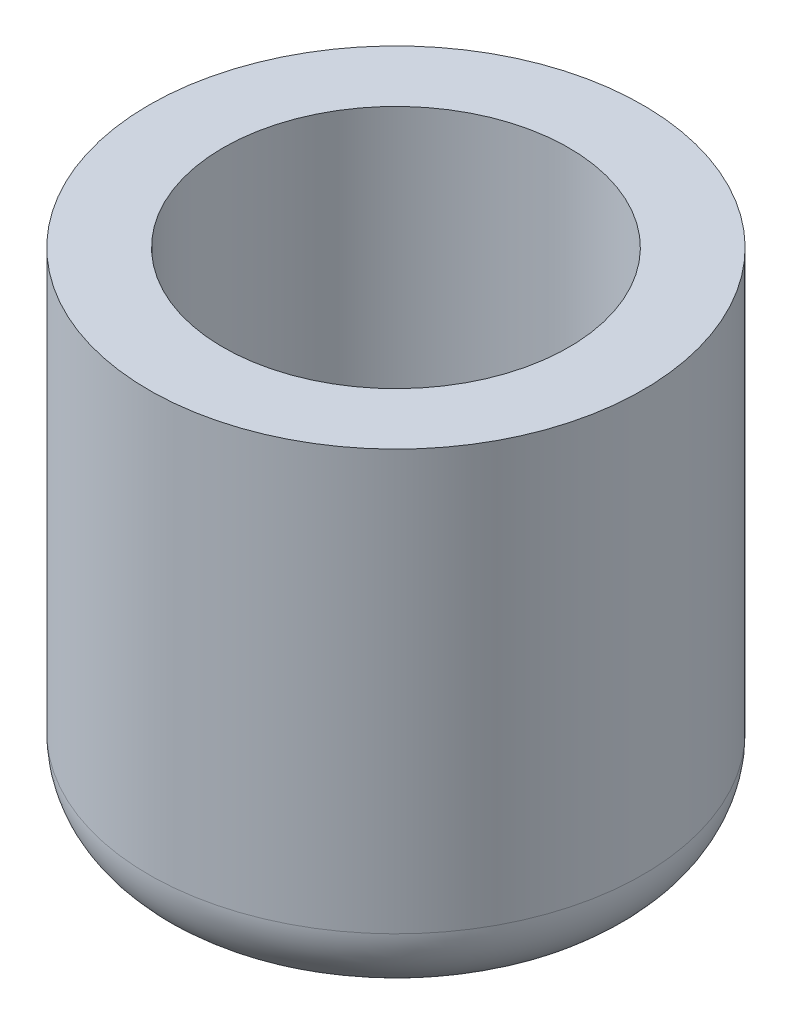
ISO-10303-21;
HEADER;
FILE_DESCRIPTION(('STEP AP214'),'2;1');
FILE_NAME('part.step','',(''),(''),'','','');
FILE_SCHEMA(('AUTOMOTIVE_DESIGN { 1 0 10303 214 1 1 1 1 }'));
ENDSEC;
DATA;
#1=APPLICATION_CONTEXT('core data for automotive mechanical design processes');
#2=APPLICATION_PROTOCOL_DEFINITION('international standard','automotive_design',2000,#1);
#3=PRODUCT_CONTEXT('',#1,'mechanical');
#4=PRODUCT('Part','Part','',(#3));
#5=PRODUCT_RELATED_PRODUCT_CATEGORY('part','',(#4));
#6=PRODUCT_DEFINITION_FORMATION('','',#4);
#7=PRODUCT_DEFINITION_CONTEXT('part definition',#1,'design');
#8=PRODUCT_DEFINITION('design','',#6,#7);
#9=PRODUCT_DEFINITION_SHAPE('','',#8);
#10=(LENGTH_UNIT() NAMED_UNIT(*) SI_UNIT(.MILLI.,.METRE.));
#11=(NAMED_UNIT(*) PLANE_ANGLE_UNIT() SI_UNIT($,.RADIAN.));
#12=(NAMED_UNIT(*) SI_UNIT($,.STERADIAN.) SOLID_ANGLE_UNIT());
#13=UNCERTAINTY_MEASURE_WITH_UNIT(LENGTH_MEASURE(1.E-05),#10,'distance_accuracy_value','');
#14=(GEOMETRIC_REPRESENTATION_CONTEXT(3) GLOBAL_UNCERTAINTY_ASSIGNED_CONTEXT((#13)) GLOBAL_UNIT_ASSIGNED_CONTEXT((#10,
#11,#12)) REPRESENTATION_CONTEXT('',''));
#15=CARTESIAN_POINT('',(0.,0.,0.));
#16=DIRECTION('',(0.,0.,1.));
#17=DIRECTION('',(1.,0.,0.));
#18=AXIS2_PLACEMENT_3D('',#15,#16,#17);
#19=CARTESIAN_POINT('',(0.,0.,0.));
#20=DIRECTION('',(0.,1.,0.));
#21=DIRECTION('',(-1.,0.,0.));
#22=AXIS2_PLACEMENT_3D('',#19,#20,#21);
#23=CYLINDRICAL_SURFACE('',#22,3.5);
#24=CARTESIAN_POINT('',(0.,0.,0.));
#25=DIRECTION('',(0.,1.,0.));
#26=DIRECTION('',(-1.,0.,0.));
#27=AXIS2_PLACEMENT_3D('',#24,#25,#26);
#28=CIRCLE('',#27,3.5);
#29=CARTESIAN_POINT('',(-3.5,0.,0.));
#30=VERTEX_POINT('',#29);
#31=EDGE_CURVE('E64',#30,#30,#28,.T.);
#32=ORIENTED_EDGE('',*,*,#31,.T.);
#33=EDGE_LOOP('',(#32));
#34=FACE_BOUND('',#33,.T.);
#35=CARTESIAN_POINT('',(0.,-8.5,0.));
#36=DIRECTION('',(0.,1.,0.));
#37=DIRECTION('',(-1.,0.,0.));
#38=AXIS2_PLACEMENT_3D('',#35,#36,#37);
#39=CIRCLE('',#38,3.5);
#40=CARTESIAN_POINT('',(-3.5,-8.5,0.));
#41=VERTEX_POINT('',#40);
#42=EDGE_CURVE('E55',#41,#41,#39,.T.);
#43=ORIENTED_EDGE('',*,*,#42,.F.);
#44=EDGE_LOOP('',(#43));
#45=FACE_BOUND('',#44,.T.);
#46=ADVANCED_FACE('F44',(#34,#45),#23,.F.);
#47=CARTESIAN_POINT('',(-5.,-8.5,0.));
#48=DIRECTION('',(0.,1.,0.));
#49=DIRECTION('',(-1.,0.,0.));
#50=AXIS2_PLACEMENT_3D('',#47,#48,#49);
#51=PLANE('',#50);
#52=ORIENTED_EDGE('',*,*,#42,.T.);
#53=EDGE_LOOP('',(#52));
#54=FACE_BOUND('',#53,.T.);
#55=ADVANCED_FACE('F83',(#54),#51,.T.);
#56=CARTESIAN_POINT('',(-5.,-10.,0.));
#57=DIRECTION('',(0.,1.,0.));
#58=DIRECTION('',(-1.,0.,0.));
#59=AXIS2_PLACEMENT_3D('',#56,#57,#58);
#60=PLANE('',#59);
#61=CARTESIAN_POINT('',(0.,-10.,0.));
#62=DIRECTION('',(0.,1.,0.));
#63=DIRECTION('',(-1.,0.,0.));
#64=AXIS2_PLACEMENT_3D('',#61,#62,#63);
#65=CIRCLE('',#64,3.5);
#66=CARTESIAN_POINT('',(-3.5,-10.,0.));
#67=VERTEX_POINT('',#66);
#68=EDGE_CURVE('E13',#67,#67,#65,.F.);
#69=ORIENTED_EDGE('',*,*,#68,.T.);
#70=EDGE_LOOP('',(#69));
#71=FACE_BOUND('',#70,.T.);
#72=ADVANCED_FACE('F78',(#71),#60,.F.);
#73=CARTESIAN_POINT('',(0.,0.,0.));
#74=DIRECTION('',(0.,1.,0.));
#75=DIRECTION('',(-1.,0.,0.));
#76=AXIS2_PLACEMENT_3D('',#73,#74,#75);
#77=CYLINDRICAL_SURFACE('',#76,5.);
#78=CARTESIAN_POINT('',(0.,-8.5,0.));
#79=DIRECTION('',(0.,1.,0.));
#80=DIRECTION('',(-1.,0.,0.));
#81=AXIS2_PLACEMENT_3D('',#78,#79,#80);
#82=CIRCLE('',#81,5.);
#83=CARTESIAN_POINT('',(-5.,-8.5,0.));
#84=VERTEX_POINT('',#83);
#85=EDGE_CURVE('E51',#84,#84,#82,.T.);
#86=ORIENTED_EDGE('',*,*,#85,.T.);
#87=EDGE_LOOP('',(#86));
#88=FACE_BOUND('',#87,.T.);
#89=CARTESIAN_POINT('',(0.,0.,0.));
#90=DIRECTION('',(0.,1.,0.));
#91=DIRECTION('',(-1.,0.,0.));
#92=AXIS2_PLACEMENT_3D('',#89,#90,#91);
#93=CIRCLE('',#92,5.);
#94=CARTESIAN_POINT('',(-5.,0.,0.));
#95=VERTEX_POINT('',#94);
#96=EDGE_CURVE('E59',#95,#95,#93,.T.);
#97=ORIENTED_EDGE('',*,*,#96,.F.);
#98=EDGE_LOOP('',(#97));
#99=FACE_BOUND('',#98,.T.);
#100=ADVANCED_FACE('F73',(#88,#99),#77,.T.);
#101=CARTESIAN_POINT('',(-5.,0.,0.));
#102=DIRECTION('',(0.,-1.,0.));
#103=DIRECTION('',(1.,0.,0.));
#104=AXIS2_PLACEMENT_3D('',#101,#102,#103);
#105=PLANE('',#104);
#106=ORIENTED_EDGE('',*,*,#31,.F.);
#107=EDGE_LOOP('',(#106));
#108=FACE_BOUND('',#107,.T.);
#109=ORIENTED_EDGE('',*,*,#96,.T.);
#110=EDGE_LOOP('',(#109));
#111=FACE_BOUND('',#110,.T.);
#112=ADVANCED_FACE('F70',(#108,#111),#105,.F.);
#113=CARTESIAN_POINT('',(0.,-8.5,0.));
#114=DIRECTION('',(0.,1.,0.));
#115=DIRECTION('',(-1.,0.,0.));
#116=AXIS2_PLACEMENT_3D('',#113,#114,#115);
#117=TOROIDAL_SURFACE('',#116,3.5,1.5);
#118=ORIENTED_EDGE('',*,*,#68,.F.);
#119=EDGE_LOOP('',(#118));
#120=FACE_BOUND('',#119,.T.);
#121=ORIENTED_EDGE('',*,*,#85,.F.);
#122=EDGE_LOOP('',(#121));
#123=FACE_BOUND('',#122,.T.);
#124=ADVANCED_FACE('F46',(#120,#123),#117,.T.);
#125=CLOSED_SHELL('',(#46,#55,#72,#100,#112,#124));
#126=MANIFOLD_SOLID_BREP('B2',#125);
#127=ADVANCED_BREP_SHAPE_REPRESENTATION('',(#18,#126),#14);
#128=SHAPE_DEFINITION_REPRESENTATION(#9,#127);
ENDSEC;
END-ISO-10303-21;
